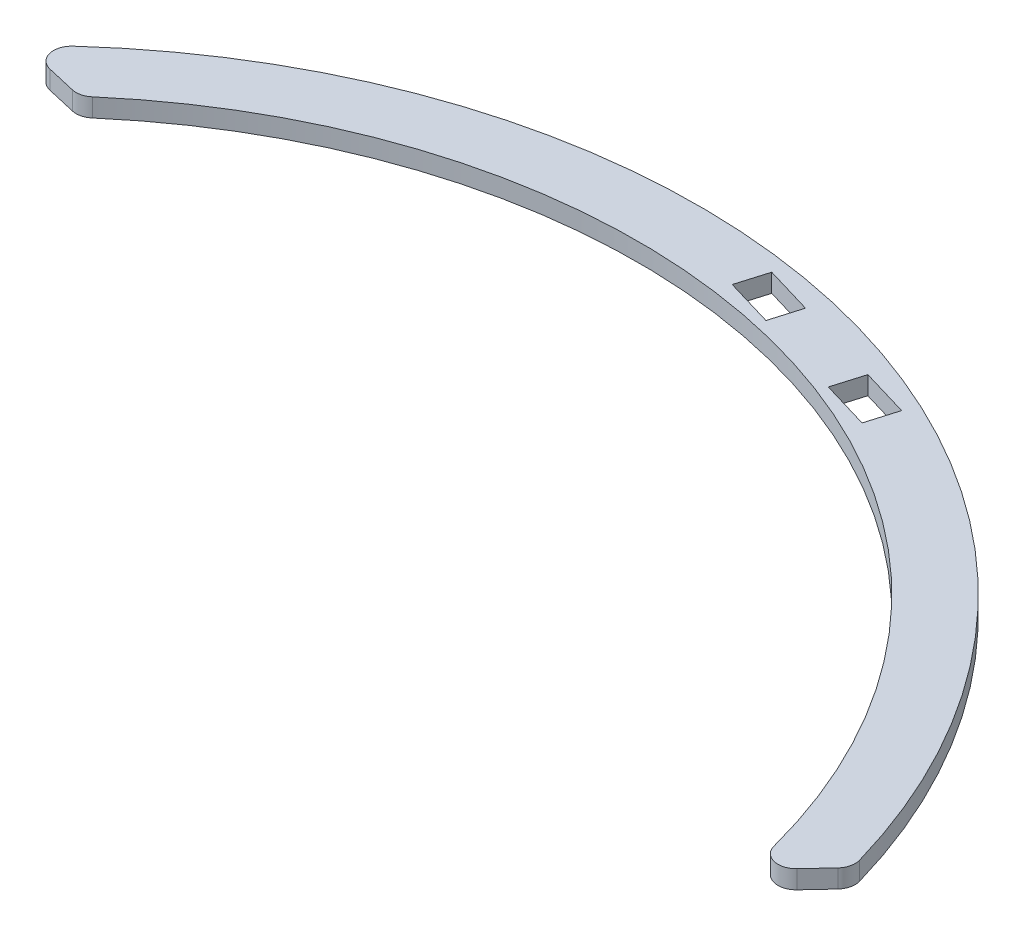
ISO-10303-21;
HEADER;
FILE_DESCRIPTION(('STEP AP214'),'2;1');
FILE_NAME('part.step','',(''),(''),'','','');
FILE_SCHEMA(('AUTOMOTIVE_DESIGN { 1 0 10303 214 1 1 1 1 }'));
ENDSEC;
DATA;
#1=APPLICATION_CONTEXT('core data for automotive mechanical design processes');
#2=APPLICATION_PROTOCOL_DEFINITION('international standard','automotive_design',2000,#1);
#3=PRODUCT_CONTEXT('',#1,'mechanical');
#4=PRODUCT('Part','Part','',(#3));
#5=PRODUCT_RELATED_PRODUCT_CATEGORY('part','',(#4));
#6=PRODUCT_DEFINITION_FORMATION('','',#4);
#7=PRODUCT_DEFINITION_CONTEXT('part definition',#1,'design');
#8=PRODUCT_DEFINITION('design','',#6,#7);
#9=PRODUCT_DEFINITION_SHAPE('','',#8);
#10=(LENGTH_UNIT() NAMED_UNIT(*) SI_UNIT(.MILLI.,.METRE.));
#11=(NAMED_UNIT(*) PLANE_ANGLE_UNIT() SI_UNIT($,.RADIAN.));
#12=(NAMED_UNIT(*) SI_UNIT($,.STERADIAN.) SOLID_ANGLE_UNIT());
#13=UNCERTAINTY_MEASURE_WITH_UNIT(LENGTH_MEASURE(1.E-05),#10,'distance_accuracy_value','');
#14=(GEOMETRIC_REPRESENTATION_CONTEXT(3) GLOBAL_UNCERTAINTY_ASSIGNED_CONTEXT((#13)) GLOBAL_UNIT_ASSIGNED_CONTEXT((#10,
#11,#12)) REPRESENTATION_CONTEXT('',''));
#15=CARTESIAN_POINT('',(0.,0.,0.));
#16=DIRECTION('',(0.,0.,1.));
#17=DIRECTION('',(1.,0.,0.));
#18=AXIS2_PLACEMENT_3D('',#15,#16,#17);
#19=CARTESIAN_POINT('',(0.,3.,0.));
#20=DIRECTION('',(0.,1.,0.));
#21=DIRECTION('',(0.,0.,1.));
#22=AXIS2_PLACEMENT_3D('',#19,#20,#21);
#23=PLANE('',#22);
#24=DIRECTION('',(0.284898072436638,0.,-0.958557816890504));
#25=VECTOR('',#24,1.);
#26=CARTESIAN_POINT('',(21.5964285856836,3.,-99.2334739085074));
#27=LINE('',#26,#25);
#28=CARTESIAN_POINT('',(21.5964285856836,3.,-99.2334739085074));
#29=VERTEX_POINT('',#28);
#30=CARTESIAN_POINT('',(23.0778985623541,3.,-104.217974556338));
#31=VERTEX_POINT('',#30);
#32=EDGE_CURVE('E182',#29,#31,#27,.T.);
#33=ORIENTED_EDGE('',*,*,#32,.F.);
#34=DIRECTION('',(0.958557816890505,0.,0.284898072436632));
#35=VECTOR('',#34,1.);
#36=CARTESIAN_POINT('',(13.7362544871814,3.,-101.569638102488));
#37=LINE('',#36,#35);
#38=CARTESIAN_POINT('',(13.7362544871814,3.,-101.569638102488));
#39=VERTEX_POINT('',#38);
#40=EDGE_CURVE('E185',#39,#29,#37,.T.);
#41=ORIENTED_EDGE('',*,*,#40,.F.);
#42=DIRECTION('',(0.284898072436639,0.,-0.958557816890503));
#43=VECTOR('',#42,1.);
#44=CARTESIAN_POINT('',(13.7362544871814,3.,-101.569638102488));
#45=LINE('',#44,#43);
#46=CARTESIAN_POINT('',(15.2177244638519,3.,-106.554138750318));
#47=VERTEX_POINT('',#46);
#48=EDGE_CURVE('E164',#39,#47,#45,.T.);
#49=ORIENTED_EDGE('',*,*,#48,.T.);
#50=DIRECTION('',(0.958557816890506,0.,0.284898072436629));
#51=VECTOR('',#50,1.);
#52=CARTESIAN_POINT('',(15.2177244638519,3.,-106.554138750318));
#53=LINE('',#52,#51);
#54=EDGE_CURVE('E176',#47,#31,#53,.T.);
#55=ORIENTED_EDGE('',*,*,#54,.T.);
#56=EDGE_LOOP('',(#33,#41,#49,#55));
#57=FACE_BOUND('',#56,.T.);
#58=DIRECTION('',(0.68249083161803,0.,-0.730894154277711));
#59=VECTOR('',#58,1.);
#60=CARTESIAN_POINT('',(97.975465343867,3.,-20.020194570801));
#61=LINE('',#60,#59);
#62=CARTESIAN_POINT('',(101.811189841036,3.,-24.1279546791003));
#63=VERTEX_POINT('',#62);
#64=CARTESIAN_POINT('',(105.015106834953,3.,-27.5590985028103));
#65=VERTEX_POINT('',#64);
#66=EDGE_CURVE('E233',#63,#65,#61,.T.);
#67=ORIENTED_EDGE('',*,*,#66,.T.);
#68=CARTESIAN_POINT('',(102.82242437212,3.,-29.6065709976644));
#69=DIRECTION('',(0.,1.,0.));
#70=DIRECTION('',(0.,0.,1.));
#71=AXIS2_PLACEMENT_3D('',#68,#69,#70);
#72=CIRCLE('',#71,3.);
#73=CARTESIAN_POINT('',(105.705296083487,3.,-30.4366617732998));
#74=VERTEX_POINT('',#73);
#75=EDGE_CURVE('E318',#65,#74,#72,.T.);
#76=ORIENTED_EDGE('',*,*,#75,.T.);
#77=CARTESIAN_POINT('',(0.,3.,0.));
#78=DIRECTION('',(0.,1.,0.));
#79=DIRECTION('',(0.,0.,1.));
#80=AXIS2_PLACEMENT_3D('',#77,#78,#79);
#81=CIRCLE('',#80,110.);
#82=CARTESIAN_POINT('',(-73.945836412834,3.,-81.4371738041442));
#83=VERTEX_POINT('',#82);
#84=EDGE_CURVE('E238',#74,#83,#81,.T.);
#85=ORIENTED_EDGE('',*,*,#84,.T.);
#86=CARTESIAN_POINT('',(-71.9291317833931,3.,-79.2161599731221));
#87=DIRECTION('',(0.,1.,0.));
#88=DIRECTION('',(0.,0.,1.));
#89=AXIS2_PLACEMENT_3D('',#86,#87,#88);
#90=CIRCLE('',#89,3.);
#91=CARTESIAN_POINT('',(-72.60595374607,3.,-76.2935050104489));
#92=VERTEX_POINT('',#91);
#93=EDGE_CURVE('E66',#83,#92,#90,.T.);
#94=ORIENTED_EDGE('',*,*,#93,.T.);
#95=DIRECTION('',(0.974218320891057,0.,0.22560732089232));
#96=VECTOR('',#95,1.);
#97=CARTESIAN_POINT('',(-66.3257297589546,3.,-74.83914464999));
#98=LINE('',#97,#96);
#99=CARTESIAN_POINT('',(-67.8197598674427,3.,-75.1851288332891));
#100=VERTEX_POINT('',#99);
#101=EDGE_CURVE('E241',#92,#100,#98,.T.);
#102=ORIENTED_EDGE('',*,*,#101,.T.);
#103=CARTESIAN_POINT('',(-67.1429379047657,3.,-78.1077837959622));
#104=DIRECTION('',(0.,1.,0.));
#105=DIRECTION('',(0.,0.,1.));
#106=AXIS2_PLACEMENT_3D('',#103,#104,#105);
#107=CIRCLE('',#106,3.);
#108=CARTESIAN_POINT('',(-65.1873183541415,3.,-75.8327998019051));
#109=VERTEX_POINT('',#108);
#110=EDGE_CURVE('E310',#100,#109,#107,.T.);
#111=ORIENTED_EDGE('',*,*,#110,.T.);
#112=CARTESIAN_POINT('',(0.,3.,0.));
#113=DIRECTION('',(0.,-1.,0.));
#114=DIRECTION('',(0.,0.,1.));
#115=AXIS2_PLACEMENT_3D('',#112,#113,#114);
#116=CIRCLE('',#115,100.);
#117=CARTESIAN_POINT('',(96.7169974545657,3.,-25.4130360912178));
#118=VERTEX_POINT('',#117);
#119=EDGE_CURVE('E229',#109,#118,#116,.T.);
#120=ORIENTED_EDGE('',*,*,#119,.T.);
#121=CARTESIAN_POINT('',(99.6185073782027,3.,-26.1754271739544));
#122=DIRECTION('',(0.,1.,0.));
#123=DIRECTION('',(0.,0.,1.));
#124=AXIS2_PLACEMENT_3D('',#121,#122,#123);
#125=CIRCLE('',#124,3.);
#126=EDGE_CURVE('E315',#118,#63,#125,.T.);
#127=ORIENTED_EDGE('',*,*,#126,.T.);
#128=EDGE_LOOP('',(#67,#76,#85,#94,#102,#111,#120,#127));
#129=FACE_BOUND('',#128,.T.);
#130=DIRECTION('',(0.958557816890506,0.,0.284898072436631));
#131=VECTOR('',#130,1.);
#132=CARTESIAN_POINT('',(36.1089939334058,3.,-94.9201170918168));
#133=LINE('',#132,#131);
#134=CARTESIAN_POINT('',(36.1089939334058,3.,-94.9201170918168));
#135=VERTEX_POINT('',#134);
#136=CARTESIAN_POINT('',(43.969168031908,3.,-92.5839528978365));
#137=VERTEX_POINT('',#136);
#138=EDGE_CURVE('E213',#135,#137,#133,.T.);
#139=ORIENTED_EDGE('',*,*,#138,.F.);
#140=DIRECTION('',(0.284898072436627,0.,-0.958557816890507));
#141=VECTOR('',#140,1.);
#142=CARTESIAN_POINT('',(36.1089939334058,3.,-94.9201170918168));
#143=LINE('',#142,#141);
#144=CARTESIAN_POINT('',(37.5904639100763,3.,-99.9046177396475));
#145=VERTEX_POINT('',#144);
#146=EDGE_CURVE('E225',#135,#145,#143,.T.);
#147=ORIENTED_EDGE('',*,*,#146,.T.);
#148=DIRECTION('',(0.958557816890505,0.,0.284898072436632));
#149=VECTOR('',#148,1.);
#150=CARTESIAN_POINT('',(37.5904639100763,3.,-99.9046177396475));
#151=LINE('',#150,#149);
#152=CARTESIAN_POINT('',(45.4506380085785,3.,-97.5684535456671));
#153=VERTEX_POINT('',#152);
#154=EDGE_CURVE('E221',#145,#153,#151,.T.);
#155=ORIENTED_EDGE('',*,*,#154,.T.);
#156=DIRECTION('',(0.28489807243663,0.,-0.958557816890506));
#157=VECTOR('',#156,1.);
#158=CARTESIAN_POINT('',(43.969168031908,3.,-92.5839528978365));
#159=LINE('',#158,#157);
#160=EDGE_CURVE('E217',#137,#153,#159,.T.);
#161=ORIENTED_EDGE('',*,*,#160,.F.);
#162=EDGE_LOOP('',(#139,#147,#155,#161));
#163=FACE_BOUND('',#162,.T.);
#164=ADVANCED_FACE('F44',(#57,#129,#163),#23,.T.);
#165=CARTESIAN_POINT('',(0.,0.,0.));
#166=DIRECTION('',(0.,1.,0.));
#167=DIRECTION('',(0.,0.,1.));
#168=AXIS2_PLACEMENT_3D('',#165,#166,#167);
#169=PLANE('',#168);
#170=DIRECTION('',(0.958557816890505,0.,0.284898072436632));
#171=VECTOR('',#170,1.);
#172=CARTESIAN_POINT('',(28.8527112595448,0.,-97.0767955001621));
#173=LINE('',#172,#171);
#174=CARTESIAN_POINT('',(13.7362544871814,0.,-101.569638102488));
#175=VERTEX_POINT('',#174);
#176=CARTESIAN_POINT('',(21.5964285856836,0.,-99.2334739085074));
#177=VERTEX_POINT('',#176);
#178=EDGE_CURVE('E276',#175,#177,#173,.T.);
#179=ORIENTED_EDGE('',*,*,#178,.T.);
#180=DIRECTION('',(0.284898072436638,0.,-0.958557816890504));
#181=VECTOR('',#180,1.);
#182=CARTESIAN_POINT('',(-7.25628267386171,0.,-2.15667840834553));
#183=LINE('',#182,#181);
#184=CARTESIAN_POINT('',(23.0778985623541,0.,-104.217974556338));
#185=VERTEX_POINT('',#184);
#186=EDGE_CURVE('E280',#177,#185,#183,.T.);
#187=ORIENTED_EDGE('',*,*,#186,.T.);
#188=DIRECTION('',(0.958557816890506,0.,0.284898072436629));
#189=VECTOR('',#188,1.);
#190=CARTESIAN_POINT('',(30.3341812362149,0.,-102.061296147993));
#191=LINE('',#190,#189);
#192=CARTESIAN_POINT('',(15.2177244638519,0.,-106.554138750318));
#193=VERTEX_POINT('',#192);
#194=EDGE_CURVE('E271',#193,#185,#191,.T.);
#195=ORIENTED_EDGE('',*,*,#194,.F.);
#196=DIRECTION('',(0.284898072436639,0.,-0.958557816890503));
#197=VECTOR('',#196,1.);
#198=CARTESIAN_POINT('',(-15.116456772364,0.,-4.49284260232601));
#199=LINE('',#198,#197);
#200=EDGE_CURVE('E167',#175,#193,#199,.T.);
#201=ORIENTED_EDGE('',*,*,#200,.F.);
#202=EDGE_LOOP('',(#179,#187,#195,#201));
#203=FACE_BOUND('',#202,.T.);
#204=CARTESIAN_POINT('',(0.,0.,0.));
#205=DIRECTION('',(0.,1.,0.));
#206=DIRECTION('',(0.,0.,1.));
#207=AXIS2_PLACEMENT_3D('',#204,#205,#206);
#208=CIRCLE('',#207,110.);
#209=CARTESIAN_POINT('',(105.705296083487,0.,-30.4366617732998));
#210=VERTEX_POINT('',#209);
#211=CARTESIAN_POINT('',(-73.945836412834,0.,-81.4371738041442));
#212=VERTEX_POINT('',#211);
#213=EDGE_CURVE('E252',#210,#212,#208,.T.);
#214=ORIENTED_EDGE('',*,*,#213,.F.);
#215=CARTESIAN_POINT('',(102.82242437212,0.,-29.6065709976644));
#216=DIRECTION('',(0.,1.,0.));
#217=DIRECTION('',(0.,0.,1.));
#218=AXIS2_PLACEMENT_3D('',#215,#216,#217);
#219=CIRCLE('',#218,3.);
#220=CARTESIAN_POINT('',(105.015106834953,0.,-27.5590985028103));
#221=VERTEX_POINT('',#220);
#222=EDGE_CURVE('E300',#210,#221,#219,.F.);
#223=ORIENTED_EDGE('',*,*,#222,.T.);
#224=DIRECTION('',(0.68249083161803,0.,-0.730894154277711));
#225=VECTOR('',#224,1.);
#226=CARTESIAN_POINT('',(97.975465343867,0.,-20.020194570801));
#227=LINE('',#226,#225);
#228=CARTESIAN_POINT('',(101.811189841036,0.,-24.1279546791003));
#229=VERTEX_POINT('',#228);
#230=EDGE_CURVE('E248',#229,#221,#227,.T.);
#231=ORIENTED_EDGE('',*,*,#230,.F.);
#232=CARTESIAN_POINT('',(99.6185073782027,0.,-26.1754271739544));
#233=DIRECTION('',(0.,1.,0.));
#234=DIRECTION('',(0.,0.,1.));
#235=AXIS2_PLACEMENT_3D('',#232,#233,#234);
#236=CIRCLE('',#235,3.);
#237=CARTESIAN_POINT('',(96.7169974545657,0.,-25.4130360912178));
#238=VERTEX_POINT('',#237);
#239=EDGE_CURVE('E297',#229,#238,#236,.F.);
#240=ORIENTED_EDGE('',*,*,#239,.T.);
#241=CARTESIAN_POINT('',(0.,0.,0.));
#242=DIRECTION('',(0.,-1.,0.));
#243=DIRECTION('',(0.,0.,1.));
#244=AXIS2_PLACEMENT_3D('',#241,#242,#243);
#245=CIRCLE('',#244,100.);
#246=CARTESIAN_POINT('',(-65.1873183541415,0.,-75.8327998019051));
#247=VERTEX_POINT('',#246);
#248=EDGE_CURVE('E195',#247,#238,#245,.T.);
#249=ORIENTED_EDGE('',*,*,#248,.F.);
#250=CARTESIAN_POINT('',(-67.1429379047657,0.,-78.1077837959622));
#251=DIRECTION('',(0.,1.,0.));
#252=DIRECTION('',(0.,0.,1.));
#253=AXIS2_PLACEMENT_3D('',#250,#251,#252);
#254=CIRCLE('',#253,3.);
#255=CARTESIAN_POINT('',(-67.8197598674427,0.,-75.1851288332891));
#256=VERTEX_POINT('',#255);
#257=EDGE_CURVE('E291',#247,#256,#254,.F.);
#258=ORIENTED_EDGE('',*,*,#257,.T.);
#259=DIRECTION('',(0.974218320891057,0.,0.22560732089232));
#260=VECTOR('',#259,1.);
#261=CARTESIAN_POINT('',(-66.3257297589546,0.,-74.83914464999));
#262=LINE('',#261,#260);
#263=CARTESIAN_POINT('',(-72.60595374607,0.,-76.2935050104489));
#264=VERTEX_POINT('',#263);
#265=EDGE_CURVE('E234',#264,#256,#262,.T.);
#266=ORIENTED_EDGE('',*,*,#265,.F.);
#267=CARTESIAN_POINT('',(-71.9291317833931,0.,-79.2161599731221));
#268=DIRECTION('',(0.,1.,0.));
#269=DIRECTION('',(0.,0.,1.));
#270=AXIS2_PLACEMENT_3D('',#267,#268,#269);
#271=CIRCLE('',#270,3.);
#272=EDGE_CURVE('E294',#264,#212,#271,.F.);
#273=ORIENTED_EDGE('',*,*,#272,.T.);
#274=EDGE_LOOP('',(#214,#223,#231,#240,#249,#258,#266,#273));
#275=FACE_BOUND('',#274,.T.);
#276=DIRECTION('',(0.284898072436627,0.,-0.958557816890507));
#277=VECTOR('',#276,1.);
#278=CARTESIAN_POINT('',(7.25628267386162,0.,2.15667840834541));
#279=LINE('',#278,#277);
#280=CARTESIAN_POINT('',(36.1089939334058,0.,-94.9201170918168));
#281=VERTEX_POINT('',#280);
#282=CARTESIAN_POINT('',(37.5904639100763,0.,-99.9046177396475));
#283=VERTEX_POINT('',#282);
#284=EDGE_CURVE('E268',#281,#283,#279,.T.);
#285=ORIENTED_EDGE('',*,*,#284,.F.);
#286=DIRECTION('',(0.958557816890506,0.,0.284898072436631));
#287=VECTOR('',#286,1.);
#288=CARTESIAN_POINT('',(28.8527112595446,0.,-97.0767955001621));
#289=LINE('',#288,#287);
#290=CARTESIAN_POINT('',(43.969168031908,0.,-92.5839528978365));
#291=VERTEX_POINT('',#290);
#292=EDGE_CURVE('E244',#281,#291,#289,.T.);
#293=ORIENTED_EDGE('',*,*,#292,.T.);
#294=DIRECTION('',(0.28489807243663,0.,-0.958557816890506));
#295=VECTOR('',#294,1.);
#296=CARTESIAN_POINT('',(15.1164567723635,0.,4.49284260232571));
#297=LINE('',#296,#295);
#298=CARTESIAN_POINT('',(45.4506380085785,0.,-97.5684535456671));
#299=VERTEX_POINT('',#298);
#300=EDGE_CURVE('E261',#291,#299,#297,.T.);
#301=ORIENTED_EDGE('',*,*,#300,.T.);
#302=DIRECTION('',(0.958557816890505,0.,0.284898072436632));
#303=VECTOR('',#302,1.);
#304=CARTESIAN_POINT('',(30.3341812362152,0.,-102.061296147993));
#305=LINE('',#304,#303);
#306=EDGE_CURVE('E265',#283,#299,#305,.T.);
#307=ORIENTED_EDGE('',*,*,#306,.F.);
#308=EDGE_LOOP('',(#285,#293,#301,#307));
#309=FACE_BOUND('',#308,.T.);
#310=ADVANCED_FACE('F347',(#203,#275,#309),#169,.F.);
#311=CARTESIAN_POINT('',(0.,3.,0.));
#312=DIRECTION('',(0.,-1.,0.));
#313=DIRECTION('',(0.,0.,-1.));
#314=AXIS2_PLACEMENT_3D('',#311,#312,#313);
#315=CYLINDRICAL_SURFACE('',#314,100.);
#316=ORIENTED_EDGE('',*,*,#248,.T.);
#317=DIRECTION('',(0.,-1.,0.));
#318=VECTOR('',#317,1.);
#319=CARTESIAN_POINT('',(96.7169974545657,3.,-25.4130360912178));
#320=LINE('',#319,#318);
#321=EDGE_CURVE('E325',#238,#118,#320,.F.);
#322=ORIENTED_EDGE('',*,*,#321,.T.);
#323=ORIENTED_EDGE('',*,*,#119,.F.);
#324=DIRECTION('',(0.,-1.,0.));
#325=VECTOR('',#324,1.);
#326=CARTESIAN_POINT('',(-65.1873183541415,3.,-75.8327998019051));
#327=LINE('',#326,#325);
#328=EDGE_CURVE('E321',#109,#247,#327,.T.);
#329=ORIENTED_EDGE('',*,*,#328,.T.);
#330=EDGE_LOOP('',(#316,#322,#323,#329));
#331=FACE_BOUND('',#330,.T.);
#332=ADVANCED_FACE('F331',(#331),#315,.F.);
#333=CARTESIAN_POINT('',(97.975465343867,3.,-20.020194570801));
#334=DIRECTION('',(-0.730894154277711,0.,-0.68249083161803));
#335=DIRECTION('',(-0.68249083161803,0.,0.730894154277711));
#336=AXIS2_PLACEMENT_3D('',#333,#334,#335);
#337=PLANE('',#336);
#338=ORIENTED_EDGE('',*,*,#230,.T.);
#339=DIRECTION('',(0.,-1.,0.));
#340=VECTOR('',#339,1.);
#341=CARTESIAN_POINT('',(105.015106834953,3.,-27.5590985028103));
#342=LINE('',#341,#340);
#343=EDGE_CURVE('E307',#221,#65,#342,.F.);
#344=ORIENTED_EDGE('',*,*,#343,.T.);
#345=ORIENTED_EDGE('',*,*,#66,.F.);
#346=DIRECTION('',(0.,-1.,0.));
#347=VECTOR('',#346,1.);
#348=CARTESIAN_POINT('',(101.811189841036,3.,-24.1279546791003));
#349=LINE('',#348,#347);
#350=EDGE_CURVE('E303',#63,#229,#349,.T.);
#351=ORIENTED_EDGE('',*,*,#350,.T.);
#352=EDGE_LOOP('',(#338,#344,#345,#351));
#353=FACE_BOUND('',#352,.T.);
#354=ADVANCED_FACE('F343',(#353),#337,.F.);
#355=CARTESIAN_POINT('',(0.,3.,0.));
#356=DIRECTION('',(0.,-1.,0.));
#357=DIRECTION('',(0.,0.,-1.));
#358=AXIS2_PLACEMENT_3D('',#355,#356,#357);
#359=CYLINDRICAL_SURFACE('',#358,110.);
#360=ORIENTED_EDGE('',*,*,#84,.F.);
#361=DIRECTION('',(0.,-1.,0.));
#362=VECTOR('',#361,1.);
#363=CARTESIAN_POINT('',(105.705296083487,3.,-30.4366617732998));
#364=LINE('',#363,#362);
#365=EDGE_CURVE('E287',#74,#210,#364,.T.);
#366=ORIENTED_EDGE('',*,*,#365,.T.);
#367=ORIENTED_EDGE('',*,*,#213,.T.);
#368=DIRECTION('',(0.,-1.,0.));
#369=VECTOR('',#368,1.);
#370=CARTESIAN_POINT('',(-73.945836412834,3.,-81.4371738041442));
#371=LINE('',#370,#369);
#372=EDGE_CURVE('E284',#212,#83,#371,.F.);
#373=ORIENTED_EDGE('',*,*,#372,.T.);
#374=EDGE_LOOP('',(#360,#366,#367,#373));
#375=FACE_BOUND('',#374,.T.);
#376=ADVANCED_FACE('F355',(#375),#359,.T.);
#377=CARTESIAN_POINT('',(-66.3257297589546,3.,-74.83914464999));
#378=DIRECTION('',(0.22560732089232,0.,-0.974218320891057));
#379=DIRECTION('',(-0.974218320891057,0.,-0.22560732089232));
#380=AXIS2_PLACEMENT_3D('',#377,#378,#379);
#381=PLANE('',#380);
#382=ORIENTED_EDGE('',*,*,#101,.F.);
#383=DIRECTION('',(0.,-1.,0.));
#384=VECTOR('',#383,1.);
#385=CARTESIAN_POINT('',(-72.60595374607,3.,-76.2935050104489));
#386=LINE('',#385,#384);
#387=EDGE_CURVE('E11',#92,#264,#386,.T.);
#388=ORIENTED_EDGE('',*,*,#387,.T.);
#389=ORIENTED_EDGE('',*,*,#265,.T.);
#390=DIRECTION('',(0.,-1.,0.));
#391=VECTOR('',#390,1.);
#392=CARTESIAN_POINT('',(-67.8197598674427,3.,-75.1851288332891));
#393=LINE('',#392,#391);
#394=EDGE_CURVE('E53',#256,#100,#393,.F.);
#395=ORIENTED_EDGE('',*,*,#394,.T.);
#396=EDGE_LOOP('',(#382,#388,#389,#395));
#397=FACE_BOUND('',#396,.T.);
#398=ADVANCED_FACE('F361',(#397),#381,.F.);
#399=CARTESIAN_POINT('',(36.1089939334058,-2.,-94.9201170918168));
#400=DIRECTION('',(0.958557816890507,0.,0.284898072436627));
#401=DIRECTION('',(0.284898072436627,0.,-0.958557816890507));
#402=AXIS2_PLACEMENT_3D('',#399,#400,#401);
#403=PLANE('',#402);
#404=ORIENTED_EDGE('',*,*,#284,.T.);
#405=DIRECTION('',(0.,1.,0.));
#406=VECTOR('',#405,1.);
#407=CARTESIAN_POINT('',(37.5904639100763,-2.,-99.9046177396475));
#408=LINE('',#407,#406);
#409=EDGE_CURVE('E200',#283,#145,#408,.T.);
#410=ORIENTED_EDGE('',*,*,#409,.T.);
#411=ORIENTED_EDGE('',*,*,#146,.F.);
#412=DIRECTION('',(0.,1.,0.));
#413=VECTOR('',#412,1.);
#414=CARTESIAN_POINT('',(36.1089939334058,-2.,-94.9201170918168));
#415=LINE('',#414,#413);
#416=EDGE_CURVE('E209',#281,#135,#415,.T.);
#417=ORIENTED_EDGE('',*,*,#416,.F.);
#418=EDGE_LOOP('',(#404,#410,#411,#417));
#419=FACE_BOUND('',#418,.T.);
#420=ADVANCED_FACE('F380',(#419),#403,.T.);
#421=CARTESIAN_POINT('',(37.5904639100763,-2.,-99.9046177396475));
#422=DIRECTION('',(-0.284898072436632,0.,0.958557816890505));
#423=DIRECTION('',(0.958557816890505,0.,0.284898072436632));
#424=AXIS2_PLACEMENT_3D('',#421,#422,#423);
#425=PLANE('',#424);
#426=ORIENTED_EDGE('',*,*,#306,.T.);
#427=DIRECTION('',(0.,1.,0.));
#428=VECTOR('',#427,1.);
#429=CARTESIAN_POINT('',(45.4506380085785,-2.,-97.5684535456671));
#430=LINE('',#429,#428);
#431=EDGE_CURVE('E203',#299,#153,#430,.T.);
#432=ORIENTED_EDGE('',*,*,#431,.T.);
#433=ORIENTED_EDGE('',*,*,#154,.F.);
#434=ORIENTED_EDGE('',*,*,#409,.F.);
#435=EDGE_LOOP('',(#426,#432,#433,#434));
#436=FACE_BOUND('',#435,.T.);
#437=ADVANCED_FACE('F491',(#436),#425,.T.);
#438=CARTESIAN_POINT('',(43.969168031908,-2.,-92.5839528978365));
#439=DIRECTION('',(0.958557816890506,0.,0.28489807243663));
#440=DIRECTION('',(0.28489807243663,0.,-0.958557816890506));
#441=AXIS2_PLACEMENT_3D('',#438,#439,#440);
#442=PLANE('',#441);
#443=DIRECTION('',(0.,1.,0.));
#444=VECTOR('',#443,1.);
#445=CARTESIAN_POINT('',(43.969168031908,-2.,-92.5839528978365));
#446=LINE('',#445,#444);
#447=EDGE_CURVE('E206',#291,#137,#446,.T.);
#448=ORIENTED_EDGE('',*,*,#447,.T.);
#449=ORIENTED_EDGE('',*,*,#160,.T.);
#450=ORIENTED_EDGE('',*,*,#431,.F.);
#451=ORIENTED_EDGE('',*,*,#300,.F.);
#452=EDGE_LOOP('',(#448,#449,#450,#451));
#453=FACE_BOUND('',#452,.T.);
#454=ADVANCED_FACE('F480',(#453),#442,.F.);
#455=CARTESIAN_POINT('',(36.1089939334058,-2.,-94.9201170918168));
#456=DIRECTION('',(-0.284898072436631,0.,0.958557816890506));
#457=DIRECTION('',(0.958557816890506,0.,0.284898072436631));
#458=AXIS2_PLACEMENT_3D('',#455,#456,#457);
#459=PLANE('',#458);
#460=ORIENTED_EDGE('',*,*,#416,.T.);
#461=ORIENTED_EDGE('',*,*,#138,.T.);
#462=ORIENTED_EDGE('',*,*,#447,.F.);
#463=ORIENTED_EDGE('',*,*,#292,.F.);
#464=EDGE_LOOP('',(#460,#461,#462,#463));
#465=FACE_BOUND('',#464,.T.);
#466=ADVANCED_FACE('F375',(#465),#459,.F.);
#467=CARTESIAN_POINT('',(21.5964285856836,-2.,-99.2334739085074));
#468=DIRECTION('',(0.958557816890504,0.,0.284898072436638));
#469=DIRECTION('',(0.284898072436638,0.,-0.958557816890504));
#470=AXIS2_PLACEMENT_3D('',#467,#468,#469);
#471=PLANE('',#470);
#472=DIRECTION('',(0.,1.,0.));
#473=VECTOR('',#472,1.);
#474=CARTESIAN_POINT('',(21.5964285856836,-2.,-99.2334739085074));
#475=LINE('',#474,#473);
#476=EDGE_CURVE('E192',#177,#29,#475,.T.);
#477=ORIENTED_EDGE('',*,*,#476,.T.);
#478=ORIENTED_EDGE('',*,*,#32,.T.);
#479=DIRECTION('',(0.,1.,0.));
#480=VECTOR('',#479,1.);
#481=CARTESIAN_POINT('',(23.0778985623541,-2.,-104.217974556338));
#482=LINE('',#481,#480);
#483=EDGE_CURVE('E172',#185,#31,#482,.T.);
#484=ORIENTED_EDGE('',*,*,#483,.F.);
#485=ORIENTED_EDGE('',*,*,#186,.F.);
#486=EDGE_LOOP('',(#477,#478,#484,#485));
#487=FACE_BOUND('',#486,.T.);
#488=ADVANCED_FACE('F457',(#487),#471,.F.);
#489=CARTESIAN_POINT('',(13.7362544871814,-2.,-101.569638102488));
#490=DIRECTION('',(-0.284898072436632,0.,0.958557816890505));
#491=DIRECTION('',(0.958557816890505,0.,0.284898072436632));
#492=AXIS2_PLACEMENT_3D('',#489,#490,#491);
#493=PLANE('',#492);
#494=DIRECTION('',(0.,1.,0.));
#495=VECTOR('',#494,1.);
#496=CARTESIAN_POINT('',(13.7362544871814,-2.,-101.569638102488));
#497=LINE('',#496,#495);
#498=EDGE_CURVE('E171',#175,#39,#497,.T.);
#499=ORIENTED_EDGE('',*,*,#498,.T.);
#500=ORIENTED_EDGE('',*,*,#40,.T.);
#501=ORIENTED_EDGE('',*,*,#476,.F.);
#502=ORIENTED_EDGE('',*,*,#178,.F.);
#503=EDGE_LOOP('',(#499,#500,#501,#502));
#504=FACE_BOUND('',#503,.T.);
#505=ADVANCED_FACE('F446',(#504),#493,.F.);
#506=CARTESIAN_POINT('',(13.7362544871814,-2.,-101.569638102488));
#507=DIRECTION('',(0.958557816890503,0.,0.284898072436639));
#508=DIRECTION('',(0.284898072436639,0.,-0.958557816890503));
#509=AXIS2_PLACEMENT_3D('',#506,#507,#508);
#510=PLANE('',#509);
#511=ORIENTED_EDGE('',*,*,#200,.T.);
#512=DIRECTION('',(0.,1.,0.));
#513=VECTOR('',#512,1.);
#514=CARTESIAN_POINT('',(15.2177244638519,-2.,-106.554138750318));
#515=LINE('',#514,#513);
#516=EDGE_CURVE('E159',#193,#47,#515,.T.);
#517=ORIENTED_EDGE('',*,*,#516,.T.);
#518=ORIENTED_EDGE('',*,*,#48,.F.);
#519=ORIENTED_EDGE('',*,*,#498,.F.);
#520=EDGE_LOOP('',(#511,#517,#518,#519));
#521=FACE_BOUND('',#520,.T.);
#522=ADVANCED_FACE('F161',(#521),#510,.T.);
#523=CARTESIAN_POINT('',(15.2177244638519,-2.,-106.554138750318));
#524=DIRECTION('',(-0.284898072436629,0.,0.958557816890506));
#525=DIRECTION('',(0.958557816890506,0.,0.284898072436629));
#526=AXIS2_PLACEMENT_3D('',#523,#524,#525);
#527=PLANE('',#526);
#528=ORIENTED_EDGE('',*,*,#194,.T.);
#529=ORIENTED_EDGE('',*,*,#483,.T.);
#530=ORIENTED_EDGE('',*,*,#54,.F.);
#531=ORIENTED_EDGE('',*,*,#516,.F.);
#532=EDGE_LOOP('',(#528,#529,#530,#531));
#533=FACE_BOUND('',#532,.T.);
#534=ADVANCED_FACE('F177',(#533),#527,.T.);
#535=CARTESIAN_POINT('',(102.82242437212,3.,-29.6065709976644));
#536=DIRECTION('',(0.,-1.,0.));
#537=DIRECTION('',(0.,0.,-1.));
#538=AXIS2_PLACEMENT_3D('',#535,#536,#537);
#539=CYLINDRICAL_SURFACE('',#538,3.);
#540=ORIENTED_EDGE('',*,*,#75,.F.);
#541=ORIENTED_EDGE('',*,*,#343,.F.);
#542=ORIENTED_EDGE('',*,*,#222,.F.);
#543=ORIENTED_EDGE('',*,*,#365,.F.);
#544=EDGE_LOOP('',(#540,#541,#542,#543));
#545=FACE_BOUND('',#544,.T.);
#546=ADVANCED_FACE('F352',(#545),#539,.T.);
#547=CARTESIAN_POINT('',(99.6185073782027,3.,-26.1754271739544));
#548=DIRECTION('',(0.,-1.,0.));
#549=DIRECTION('',(0.,0.,-1.));
#550=AXIS2_PLACEMENT_3D('',#547,#548,#549);
#551=CYLINDRICAL_SURFACE('',#550,3.);
#552=ORIENTED_EDGE('',*,*,#126,.F.);
#553=ORIENTED_EDGE('',*,*,#321,.F.);
#554=ORIENTED_EDGE('',*,*,#239,.F.);
#555=ORIENTED_EDGE('',*,*,#350,.F.);
#556=EDGE_LOOP('',(#552,#553,#554,#555));
#557=FACE_BOUND('',#556,.T.);
#558=ADVANCED_FACE('F340',(#557),#551,.T.);
#559=CARTESIAN_POINT('',(-71.9291317833931,3.,-79.2161599731221));
#560=DIRECTION('',(0.,-1.,0.));
#561=DIRECTION('',(0.,0.,-1.));
#562=AXIS2_PLACEMENT_3D('',#559,#560,#561);
#563=CYLINDRICAL_SURFACE('',#562,3.);
#564=ORIENTED_EDGE('',*,*,#93,.F.);
#565=ORIENTED_EDGE('',*,*,#372,.F.);
#566=ORIENTED_EDGE('',*,*,#272,.F.);
#567=ORIENTED_EDGE('',*,*,#387,.F.);
#568=EDGE_LOOP('',(#564,#565,#566,#567));
#569=FACE_BOUND('',#568,.T.);
#570=ADVANCED_FACE('F359',(#569),#563,.T.);
#571=CARTESIAN_POINT('',(-67.1429379047657,3.,-78.1077837959622));
#572=DIRECTION('',(0.,-1.,0.));
#573=DIRECTION('',(0.,0.,-1.));
#574=AXIS2_PLACEMENT_3D('',#571,#572,#573);
#575=CYLINDRICAL_SURFACE('',#574,3.);
#576=ORIENTED_EDGE('',*,*,#110,.F.);
#577=ORIENTED_EDGE('',*,*,#394,.F.);
#578=ORIENTED_EDGE('',*,*,#257,.F.);
#579=ORIENTED_EDGE('',*,*,#328,.F.);
#580=EDGE_LOOP('',(#576,#577,#578,#579));
#581=FACE_BOUND('',#580,.T.);
#582=ADVANCED_FACE('F46',(#581),#575,.T.);
#583=CLOSED_SHELL('',(#164,#310,#332,#354,#376,#398,#420,#437,#454,#466,#488,#505,#522,#534,
#546,#558,#570,#582));
#584=MANIFOLD_SOLID_BREP('B2',#583);
#585=ADVANCED_BREP_SHAPE_REPRESENTATION('',(#18,#584),#14);
#586=SHAPE_DEFINITION_REPRESENTATION(#9,#585);
ENDSEC;
END-ISO-10303-21;
